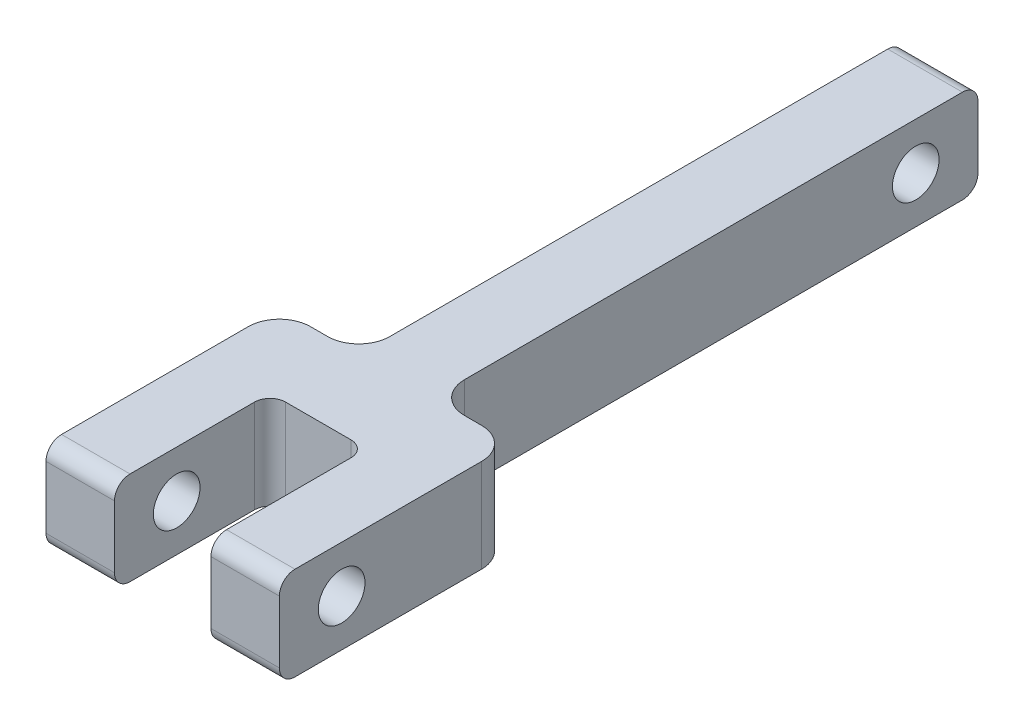
ISO-10303-21;
HEADER;
FILE_DESCRIPTION(('STEP AP214'),'2;1');
FILE_NAME('part.step','',(''),(''),'','','');
FILE_SCHEMA(('AUTOMOTIVE_DESIGN { 1 0 10303 214 1 1 1 1 }'));
ENDSEC;
DATA;
#1=APPLICATION_CONTEXT('core data for automotive mechanical design processes');
#2=APPLICATION_PROTOCOL_DEFINITION('international standard','automotive_design',2000,#1);
#3=PRODUCT_CONTEXT('',#1,'mechanical');
#4=PRODUCT('Part','Part','',(#3));
#5=PRODUCT_RELATED_PRODUCT_CATEGORY('part','',(#4));
#6=PRODUCT_DEFINITION_FORMATION('','',#4);
#7=PRODUCT_DEFINITION_CONTEXT('part definition',#1,'design');
#8=PRODUCT_DEFINITION('design','',#6,#7);
#9=PRODUCT_DEFINITION_SHAPE('','',#8);
#10=(LENGTH_UNIT() NAMED_UNIT(*) SI_UNIT(.MILLI.,.METRE.));
#11=(NAMED_UNIT(*) PLANE_ANGLE_UNIT() SI_UNIT($,.RADIAN.));
#12=(NAMED_UNIT(*) SI_UNIT($,.STERADIAN.) SOLID_ANGLE_UNIT());
#13=UNCERTAINTY_MEASURE_WITH_UNIT(LENGTH_MEASURE(1.E-05),#10,'distance_accuracy_value','');
#14=(GEOMETRIC_REPRESENTATION_CONTEXT(3) GLOBAL_UNCERTAINTY_ASSIGNED_CONTEXT((#13)) GLOBAL_UNIT_ASSIGNED_CONTEXT((#10,
#11,#12)) REPRESENTATION_CONTEXT('',''));
#15=CARTESIAN_POINT('',(0.,0.,0.));
#16=DIRECTION('',(0.,0.,1.));
#17=DIRECTION('',(1.,0.,0.));
#18=AXIS2_PLACEMENT_3D('',#15,#16,#17);
#19=CARTESIAN_POINT('',(2.4,-2.,24.));
#20=DIRECTION('',(-1.,0.,0.));
#21=DIRECTION('',(0.,0.,1.));
#22=AXIS2_PLACEMENT_3D('',#19,#20,#21);
#23=CYLINDRICAL_SURFACE('',#22,1.);
#24=CARTESIAN_POINT('',(-3.1,-2.,24.));
#25=DIRECTION('',(1.,0.,0.));
#26=DIRECTION('',(0.,0.,-1.));
#27=AXIS2_PLACEMENT_3D('',#24,#25,#26);
#28=CIRCLE('',#27,1.);
#29=CARTESIAN_POINT('',(-3.1,-2.,25.));
#30=VERTEX_POINT('',#29);
#31=CARTESIAN_POINT('',(-3.1,-3.,24.));
#32=VERTEX_POINT('',#31);
#33=EDGE_CURVE('E216',#30,#32,#28,.T.);
#34=ORIENTED_EDGE('',*,*,#33,.F.);
#35=DIRECTION('',(-1.,0.,0.));
#36=VECTOR('',#35,1.);
#37=CARTESIAN_POINT('',(2.4,-2.,25.));
#38=LINE('',#37,#36);
#39=CARTESIAN_POINT('',(-7.5,-2.,25.));
#40=VERTEX_POINT('',#39);
#41=EDGE_CURVE('E215',#30,#40,#38,.T.);
#42=ORIENTED_EDGE('',*,*,#41,.T.);
#43=CARTESIAN_POINT('',(-7.5,-2.,24.));
#44=DIRECTION('',(1.,0.,0.));
#45=DIRECTION('',(0.,0.,-1.));
#46=AXIS2_PLACEMENT_3D('',#43,#44,#45);
#47=CIRCLE('',#46,1.);
#48=CARTESIAN_POINT('',(-7.5,-3.,24.));
#49=VERTEX_POINT('',#48);
#50=EDGE_CURVE('E361',#40,#49,#47,.T.);
#51=ORIENTED_EDGE('',*,*,#50,.T.);
#52=DIRECTION('',(-1.,0.,0.));
#53=VECTOR('',#52,1.);
#54=CARTESIAN_POINT('',(2.4,-3.,24.));
#55=LINE('',#54,#53);
#56=EDGE_CURVE('E246',#32,#49,#55,.T.);
#57=ORIENTED_EDGE('',*,*,#56,.F.);
#58=EDGE_LOOP('',(#34,#42,#51,#57));
#59=FACE_BOUND('',#58,.T.);
#60=ADVANCED_FACE('F35',(#59),#23,.T.);
#61=CARTESIAN_POINT('',(2.4,-3.,24.));
#62=DIRECTION('',(0.,1.,0.));
#63=DIRECTION('',(0.,0.,1.));
#64=AXIS2_PLACEMENT_3D('',#61,#62,#63);
#65=PLANE('',#64);
#66=DIRECTION('',(-1.,0.,0.));
#67=VECTOR('',#66,1.);
#68=CARTESIAN_POINT('',(7.5,-3.,10.));
#69=LINE('',#68,#67);
#70=CARTESIAN_POINT('',(5.5,-3.,10.));
#71=VERTEX_POINT('',#70);
#72=CARTESIAN_POINT('',(4.4,-3.,10.));
#73=VERTEX_POINT('',#72);
#74=EDGE_CURVE('E374',#71,#73,#69,.T.);
#75=ORIENTED_EDGE('',*,*,#74,.F.);
#76=CARTESIAN_POINT('',(5.5,-3.,12.));
#77=DIRECTION('',(0.,1.,0.));
#78=DIRECTION('',(0.,0.,1.));
#79=AXIS2_PLACEMENT_3D('',#76,#77,#78);
#80=CIRCLE('',#79,2.);
#81=CARTESIAN_POINT('',(7.5,-3.,12.));
#82=VERTEX_POINT('',#81);
#83=EDGE_CURVE('E271',#71,#82,#80,.F.);
#84=ORIENTED_EDGE('',*,*,#83,.T.);
#85=DIRECTION('',(0.,0.,-1.));
#86=VECTOR('',#85,1.);
#87=CARTESIAN_POINT('',(7.5,-3.,10.));
#88=LINE('',#87,#86);
#89=CARTESIAN_POINT('',(7.5,-3.,24.));
#90=VERTEX_POINT('',#89);
#91=EDGE_CURVE('E352',#90,#82,#88,.T.);
#92=ORIENTED_EDGE('',*,*,#91,.F.);
#93=CARTESIAN_POINT('',(3.1,-3.,24.));
#94=VERTEX_POINT('',#93);
#95=EDGE_CURVE('E247',#90,#94,#55,.T.);
#96=ORIENTED_EDGE('',*,*,#95,.T.);
#97=DIRECTION('',(0.,0.,-1.));
#98=VECTOR('',#97,1.);
#99=CARTESIAN_POINT('',(3.1,-3.,15.));
#100=LINE('',#99,#98);
#101=CARTESIAN_POINT('',(3.1,-3.,16.));
#102=VERTEX_POINT('',#101);
#103=EDGE_CURVE('E332',#94,#102,#100,.T.);
#104=ORIENTED_EDGE('',*,*,#103,.T.);
#105=CARTESIAN_POINT('',(2.1,-3.,16.));
#106=DIRECTION('',(0.,1.,0.));
#107=DIRECTION('',(0.,0.,1.));
#108=AXIS2_PLACEMENT_3D('',#105,#106,#107);
#109=CIRCLE('',#108,1.);
#110=CARTESIAN_POINT('',(2.1,-3.,15.));
#111=VERTEX_POINT('',#110);
#112=EDGE_CURVE('E305',#102,#111,#109,.T.);
#113=ORIENTED_EDGE('',*,*,#112,.T.);
#114=DIRECTION('',(1.,0.,0.));
#115=VECTOR('',#114,1.);
#116=CARTESIAN_POINT('',(-3.1,-3.,15.));
#117=LINE('',#116,#115);
#118=CARTESIAN_POINT('',(-2.1,-3.,15.));
#119=VERTEX_POINT('',#118);
#120=EDGE_CURVE('E315',#119,#111,#117,.T.);
#121=ORIENTED_EDGE('',*,*,#120,.F.);
#122=CARTESIAN_POINT('',(-2.1,-3.,16.));
#123=DIRECTION('',(0.,1.,0.));
#124=DIRECTION('',(0.,0.,1.));
#125=AXIS2_PLACEMENT_3D('',#122,#123,#124);
#126=CIRCLE('',#125,1.);
#127=CARTESIAN_POINT('',(-3.1,-3.,16.));
#128=VERTEX_POINT('',#127);
#129=EDGE_CURVE('E11',#119,#128,#126,.T.);
#130=ORIENTED_EDGE('',*,*,#129,.T.);
#131=DIRECTION('',(0.,0.,-1.));
#132=VECTOR('',#131,1.);
#133=CARTESIAN_POINT('',(-3.1,-3.,15.));
#134=LINE('',#133,#132);
#135=EDGE_CURVE('E317',#32,#128,#134,.T.);
#136=ORIENTED_EDGE('',*,*,#135,.F.);
#137=ORIENTED_EDGE('',*,*,#56,.T.);
#138=DIRECTION('',(0.,0.,-1.));
#139=VECTOR('',#138,1.);
#140=CARTESIAN_POINT('',(-7.5,-3.,10.));
#141=LINE('',#140,#139);
#142=CARTESIAN_POINT('',(-7.5,-3.,12.));
#143=VERTEX_POINT('',#142);
#144=EDGE_CURVE('E364',#49,#143,#141,.T.);
#145=ORIENTED_EDGE('',*,*,#144,.T.);
#146=CARTESIAN_POINT('',(-5.5,-3.,12.));
#147=DIRECTION('',(0.,1.,0.));
#148=DIRECTION('',(0.,0.,1.));
#149=AXIS2_PLACEMENT_3D('',#146,#147,#148);
#150=CIRCLE('',#149,2.);
#151=CARTESIAN_POINT('',(-5.5,-3.,10.));
#152=VERTEX_POINT('',#151);
#153=EDGE_CURVE('E269',#143,#152,#150,.F.);
#154=ORIENTED_EDGE('',*,*,#153,.T.);
#155=CARTESIAN_POINT('',(-4.4,-3.,10.));
#156=VERTEX_POINT('',#155);
#157=EDGE_CURVE('E371',#156,#152,#69,.T.);
#158=ORIENTED_EDGE('',*,*,#157,.F.);
#159=CARTESIAN_POINT('',(-4.4,-3.,8.));
#160=DIRECTION('',(0.,1.,0.));
#161=DIRECTION('',(0.,0.,1.));
#162=AXIS2_PLACEMENT_3D('',#159,#160,#161);
#163=CIRCLE('',#162,2.);
#164=CARTESIAN_POINT('',(-2.4,-3.,8.));
#165=VERTEX_POINT('',#164);
#166=EDGE_CURVE('E290',#156,#165,#163,.T.);
#167=ORIENTED_EDGE('',*,*,#166,.T.);
#168=DIRECTION('',(0.,0.,-1.));
#169=VECTOR('',#168,1.);
#170=CARTESIAN_POINT('',(-2.4,-3.,24.));
#171=LINE('',#170,#169);
#172=CARTESIAN_POINT('',(-2.4,-3.,-24.));
#173=VERTEX_POINT('',#172);
#174=EDGE_CURVE('E381',#165,#173,#171,.T.);
#175=ORIENTED_EDGE('',*,*,#174,.T.);
#176=DIRECTION('',(-1.,0.,0.));
#177=VECTOR('',#176,1.);
#178=CARTESIAN_POINT('',(2.4,-3.,-24.));
#179=LINE('',#178,#177);
#180=CARTESIAN_POINT('',(2.4,-3.,-24.));
#181=VERTEX_POINT('',#180);
#182=EDGE_CURVE('E243',#181,#173,#179,.T.);
#183=ORIENTED_EDGE('',*,*,#182,.F.);
#184=DIRECTION('',(0.,0.,-1.));
#185=VECTOR('',#184,1.);
#186=CARTESIAN_POINT('',(2.4,-3.,24.));
#187=LINE('',#186,#185);
#188=CARTESIAN_POINT('',(2.4,-3.,8.));
#189=VERTEX_POINT('',#188);
#190=EDGE_CURVE('E382',#189,#181,#187,.T.);
#191=ORIENTED_EDGE('',*,*,#190,.F.);
#192=CARTESIAN_POINT('',(4.4,-3.,8.));
#193=DIRECTION('',(0.,1.,0.));
#194=DIRECTION('',(0.,0.,1.));
#195=AXIS2_PLACEMENT_3D('',#192,#193,#194);
#196=CIRCLE('',#195,2.);
#197=EDGE_CURVE('E286',#189,#73,#196,.T.);
#198=ORIENTED_EDGE('',*,*,#197,.T.);
#199=EDGE_LOOP('',(#75,#84,#92,#96,#104,#113,#121,#130,#136,#137,#145,#154,#158,#167,#175,#183,
#191,#198));
#200=FACE_BOUND('',#199,.T.);
#201=ADVANCED_FACE('F417',(#200),#65,.F.);
#202=CARTESIAN_POINT('',(2.4,3.,24.));
#203=DIRECTION('',(0.,-1.,0.));
#204=DIRECTION('',(0.,0.,-1.));
#205=AXIS2_PLACEMENT_3D('',#202,#203,#204);
#206=PLANE('',#205);
#207=DIRECTION('',(0.,0.,1.));
#208=VECTOR('',#207,1.);
#209=CARTESIAN_POINT('',(7.5,3.,24.));
#210=LINE('',#209,#208);
#211=CARTESIAN_POINT('',(7.5,3.,12.));
#212=VERTEX_POINT('',#211);
#213=CARTESIAN_POINT('',(7.5,3.,24.));
#214=VERTEX_POINT('',#213);
#215=EDGE_CURVE('E355',#212,#214,#210,.T.);
#216=ORIENTED_EDGE('',*,*,#215,.F.);
#217=CARTESIAN_POINT('',(5.5,3.,12.));
#218=DIRECTION('',(0.,-1.,0.));
#219=DIRECTION('',(0.,0.,-1.));
#220=AXIS2_PLACEMENT_3D('',#217,#218,#219);
#221=CIRCLE('',#220,2.);
#222=CARTESIAN_POINT('',(5.5,3.,10.));
#223=VERTEX_POINT('',#222);
#224=EDGE_CURVE('E263',#212,#223,#221,.F.);
#225=ORIENTED_EDGE('',*,*,#224,.T.);
#226=DIRECTION('',(-1.,0.,0.));
#227=VECTOR('',#226,1.);
#228=CARTESIAN_POINT('',(7.5,3.,10.));
#229=LINE('',#228,#227);
#230=CARTESIAN_POINT('',(4.4,3.,10.));
#231=VERTEX_POINT('',#230);
#232=EDGE_CURVE('E370',#223,#231,#229,.T.);
#233=ORIENTED_EDGE('',*,*,#232,.T.);
#234=CARTESIAN_POINT('',(4.4,3.,8.));
#235=DIRECTION('',(0.,-1.,0.));
#236=DIRECTION('',(0.,0.,-1.));
#237=AXIS2_PLACEMENT_3D('',#234,#235,#236);
#238=CIRCLE('',#237,2.);
#239=CARTESIAN_POINT('',(2.4,3.,8.));
#240=VERTEX_POINT('',#239);
#241=EDGE_CURVE('E288',#231,#240,#238,.T.);
#242=ORIENTED_EDGE('',*,*,#241,.T.);
#243=DIRECTION('',(0.,0.,1.));
#244=VECTOR('',#243,1.);
#245=CARTESIAN_POINT('',(2.4,3.,24.));
#246=LINE('',#245,#244);
#247=CARTESIAN_POINT('',(2.4,3.,-24.));
#248=VERTEX_POINT('',#247);
#249=EDGE_CURVE('E391',#248,#240,#246,.T.);
#250=ORIENTED_EDGE('',*,*,#249,.F.);
#251=DIRECTION('',(-1.,0.,0.));
#252=VECTOR('',#251,1.);
#253=CARTESIAN_POINT('',(2.4,3.,-24.));
#254=LINE('',#253,#252);
#255=CARTESIAN_POINT('',(-2.4,3.,-24.));
#256=VERTEX_POINT('',#255);
#257=EDGE_CURVE('E234',#248,#256,#254,.T.);
#258=ORIENTED_EDGE('',*,*,#257,.T.);
#259=DIRECTION('',(0.,0.,1.));
#260=VECTOR('',#259,1.);
#261=CARTESIAN_POINT('',(-2.4,3.,24.));
#262=LINE('',#261,#260);
#263=CARTESIAN_POINT('',(-2.4,3.,8.));
#264=VERTEX_POINT('',#263);
#265=EDGE_CURVE('E385',#256,#264,#262,.T.);
#266=ORIENTED_EDGE('',*,*,#265,.T.);
#267=CARTESIAN_POINT('',(-4.4,3.,8.));
#268=DIRECTION('',(0.,-1.,0.));
#269=DIRECTION('',(0.,0.,-1.));
#270=AXIS2_PLACEMENT_3D('',#267,#268,#269);
#271=CIRCLE('',#270,2.);
#272=CARTESIAN_POINT('',(-4.4,3.,10.));
#273=VERTEX_POINT('',#272);
#274=EDGE_CURVE('E292',#264,#273,#271,.T.);
#275=ORIENTED_EDGE('',*,*,#274,.T.);
#276=CARTESIAN_POINT('',(-5.5,3.,10.));
#277=VERTEX_POINT('',#276);
#278=EDGE_CURVE('E357',#273,#277,#229,.T.);
#279=ORIENTED_EDGE('',*,*,#278,.T.);
#280=CARTESIAN_POINT('',(-5.5,3.,12.));
#281=DIRECTION('',(0.,-1.,0.));
#282=DIRECTION('',(0.,0.,-1.));
#283=AXIS2_PLACEMENT_3D('',#280,#281,#282);
#284=CIRCLE('',#283,2.);
#285=CARTESIAN_POINT('',(-7.5,3.,12.));
#286=VERTEX_POINT('',#285);
#287=EDGE_CURVE('E261',#277,#286,#284,.F.);
#288=ORIENTED_EDGE('',*,*,#287,.T.);
#289=DIRECTION('',(0.,0.,1.));
#290=VECTOR('',#289,1.);
#291=CARTESIAN_POINT('',(-7.5,3.,24.));
#292=LINE('',#291,#290);
#293=CARTESIAN_POINT('',(-7.5,3.,24.));
#294=VERTEX_POINT('',#293);
#295=EDGE_CURVE('E346',#286,#294,#292,.T.);
#296=ORIENTED_EDGE('',*,*,#295,.T.);
#297=DIRECTION('',(-1.,0.,0.));
#298=VECTOR('',#297,1.);
#299=CARTESIAN_POINT('',(2.4,3.,24.));
#300=LINE('',#299,#298);
#301=CARTESIAN_POINT('',(-3.1,3.,24.));
#302=VERTEX_POINT('',#301);
#303=EDGE_CURVE('E226',#302,#294,#300,.T.);
#304=ORIENTED_EDGE('',*,*,#303,.F.);
#305=DIRECTION('',(0.,0.,1.));
#306=VECTOR('',#305,1.);
#307=CARTESIAN_POINT('',(-3.1,3.,24.));
#308=LINE('',#307,#306);
#309=CARTESIAN_POINT('',(-3.1,3.,16.));
#310=VERTEX_POINT('',#309);
#311=EDGE_CURVE('E202',#310,#302,#308,.T.);
#312=ORIENTED_EDGE('',*,*,#311,.F.);
#313=CARTESIAN_POINT('',(-2.1,3.,16.));
#314=DIRECTION('',(0.,-1.,0.));
#315=DIRECTION('',(0.,0.,-1.));
#316=AXIS2_PLACEMENT_3D('',#313,#314,#315);
#317=CIRCLE('',#316,1.);
#318=CARTESIAN_POINT('',(-2.1,3.,15.));
#319=VERTEX_POINT('',#318);
#320=EDGE_CURVE('E43',#310,#319,#317,.T.);
#321=ORIENTED_EDGE('',*,*,#320,.T.);
#322=DIRECTION('',(1.,0.,0.));
#323=VECTOR('',#322,1.);
#324=CARTESIAN_POINT('',(-3.1,3.,15.));
#325=LINE('',#324,#323);
#326=CARTESIAN_POINT('',(2.1,3.,15.));
#327=VERTEX_POINT('',#326);
#328=EDGE_CURVE('E255',#319,#327,#325,.T.);
#329=ORIENTED_EDGE('',*,*,#328,.T.);
#330=CARTESIAN_POINT('',(2.1,3.,16.));
#331=DIRECTION('',(0.,-1.,0.));
#332=DIRECTION('',(0.,0.,-1.));
#333=AXIS2_PLACEMENT_3D('',#330,#331,#332);
#334=CIRCLE('',#333,1.);
#335=CARTESIAN_POINT('',(3.1,3.,16.));
#336=VERTEX_POINT('',#335);
#337=EDGE_CURVE('E303',#327,#336,#334,.T.);
#338=ORIENTED_EDGE('',*,*,#337,.T.);
#339=DIRECTION('',(0.,0.,1.));
#340=VECTOR('',#339,1.);
#341=CARTESIAN_POINT('',(3.1,3.,24.));
#342=LINE('',#341,#340);
#343=CARTESIAN_POINT('',(3.1,3.,24.));
#344=VERTEX_POINT('',#343);
#345=EDGE_CURVE('E207',#336,#344,#342,.T.);
#346=ORIENTED_EDGE('',*,*,#345,.T.);
#347=EDGE_CURVE('E231',#214,#344,#300,.T.);
#348=ORIENTED_EDGE('',*,*,#347,.F.);
#349=EDGE_LOOP('',(#216,#225,#233,#242,#250,#258,#266,#275,#279,#288,#296,#304,#312,#321,#329,
#338,#346,#348));
#350=FACE_BOUND('',#349,.T.);
#351=ADVANCED_FACE('F310',(#350),#206,.F.);
#352=CARTESIAN_POINT('',(2.4,2.,24.));
#353=DIRECTION('',(-1.,0.,0.));
#354=DIRECTION('',(0.,0.,1.));
#355=AXIS2_PLACEMENT_3D('',#352,#353,#354);
#356=CYLINDRICAL_SURFACE('',#355,1.);
#357=CARTESIAN_POINT('',(-3.1,2.,24.));
#358=DIRECTION('',(1.,0.,0.));
#359=DIRECTION('',(0.,0.,-1.));
#360=AXIS2_PLACEMENT_3D('',#357,#358,#359);
#361=CIRCLE('',#360,1.);
#362=CARTESIAN_POINT('',(-3.1,2.,25.));
#363=VERTEX_POINT('',#362);
#364=EDGE_CURVE('E195',#302,#363,#361,.T.);
#365=ORIENTED_EDGE('',*,*,#364,.F.);
#366=ORIENTED_EDGE('',*,*,#303,.T.);
#367=CARTESIAN_POINT('',(-7.5,2.,24.));
#368=DIRECTION('',(1.,0.,0.));
#369=DIRECTION('',(0.,0.,-1.));
#370=AXIS2_PLACEMENT_3D('',#367,#368,#369);
#371=CIRCLE('',#370,1.);
#372=CARTESIAN_POINT('',(-7.5,2.,25.));
#373=VERTEX_POINT('',#372);
#374=EDGE_CURVE('E221',#294,#373,#371,.T.);
#375=ORIENTED_EDGE('',*,*,#374,.T.);
#376=DIRECTION('',(-1.,0.,0.));
#377=VECTOR('',#376,1.);
#378=CARTESIAN_POINT('',(2.4,2.,25.));
#379=LINE('',#378,#377);
#380=EDGE_CURVE('E213',#363,#373,#379,.T.);
#381=ORIENTED_EDGE('',*,*,#380,.F.);
#382=EDGE_LOOP('',(#365,#366,#375,#381));
#383=FACE_BOUND('',#382,.T.);
#384=ADVANCED_FACE('F219',(#383),#356,.T.);
#385=CARTESIAN_POINT('',(2.4,2.,25.));
#386=DIRECTION('',(0.,0.,-1.));
#387=DIRECTION('',(-1.,0.,0.));
#388=AXIS2_PLACEMENT_3D('',#385,#386,#387);
#389=PLANE('',#388);
#390=DIRECTION('',(0.,-1.,0.));
#391=VECTOR('',#390,1.);
#392=CARTESIAN_POINT('',(-3.1,2.,25.));
#393=LINE('',#392,#391);
#394=EDGE_CURVE('E199',#363,#30,#393,.T.);
#395=ORIENTED_EDGE('',*,*,#394,.F.);
#396=ORIENTED_EDGE('',*,*,#380,.T.);
#397=DIRECTION('',(0.,-1.,0.));
#398=VECTOR('',#397,1.);
#399=CARTESIAN_POINT('',(-7.5,2.,25.));
#400=LINE('',#399,#398);
#401=EDGE_CURVE('E359',#373,#40,#400,.T.);
#402=ORIENTED_EDGE('',*,*,#401,.T.);
#403=ORIENTED_EDGE('',*,*,#41,.F.);
#404=EDGE_LOOP('',(#395,#396,#402,#403));
#405=FACE_BOUND('',#404,.T.);
#406=ADVANCED_FACE('F211',(#405),#389,.F.);
#407=CARTESIAN_POINT('',(-2.4,0.,21.));
#408=DIRECTION('',(1.,0.,0.));
#409=DIRECTION('',(0.,0.,-1.));
#410=AXIS2_PLACEMENT_3D('',#407,#408,#409);
#411=CYLINDRICAL_SURFACE('',#410,1.5);
#412=CARTESIAN_POINT('',(-7.5,0.,21.));
#413=DIRECTION('',(1.,0.,0.));
#414=DIRECTION('',(0.,0.,-1.));
#415=AXIS2_PLACEMENT_3D('',#412,#413,#414);
#416=CIRCLE('',#415,1.5);
#417=CARTESIAN_POINT('',(-7.5,0.,19.5));
#418=VERTEX_POINT('',#417);
#419=EDGE_CURVE('E258',#418,#418,#416,.T.);
#420=ORIENTED_EDGE('',*,*,#419,.F.);
#421=EDGE_LOOP('',(#420));
#422=FACE_BOUND('',#421,.T.);
#423=CARTESIAN_POINT('',(-3.1,0.,21.));
#424=DIRECTION('',(1.,0.,0.));
#425=DIRECTION('',(0.,0.,-1.));
#426=AXIS2_PLACEMENT_3D('',#423,#424,#425);
#427=CIRCLE('',#426,1.5);
#428=CARTESIAN_POINT('',(-3.1,0.,19.5));
#429=VERTEX_POINT('',#428);
#430=EDGE_CURVE('E254',#429,#429,#427,.F.);
#431=ORIENTED_EDGE('',*,*,#430,.F.);
#432=EDGE_LOOP('',(#431));
#433=FACE_BOUND('',#432,.T.);
#434=ADVANCED_FACE('F517',(#422,#433),#411,.F.);
#435=CARTESIAN_POINT('',(2.4,-2.,24.));
#436=DIRECTION('',(1.,0.,0.));
#437=DIRECTION('',(0.,0.,-1.));
#438=AXIS2_PLACEMENT_3D('',#435,#436,#437);
#439=PLANE('',#438);
#440=CARTESIAN_POINT('',(2.4,0.,-21.));
#441=DIRECTION('',(1.,0.,0.));
#442=DIRECTION('',(0.,0.,-1.));
#443=AXIS2_PLACEMENT_3D('',#440,#441,#442);
#444=CIRCLE('',#443,1.50000000000001);
#445=CARTESIAN_POINT('',(2.4,0.,-22.5));
#446=VERTEX_POINT('',#445);
#447=EDGE_CURVE('E375',#446,#446,#444,.T.);
#448=ORIENTED_EDGE('',*,*,#447,.F.);
#449=EDGE_LOOP('',(#448));
#450=FACE_BOUND('',#449,.T.);
#451=ORIENTED_EDGE('',*,*,#249,.T.);
#452=DIRECTION('',(0.,-1.,0.));
#453=VECTOR('',#452,1.);
#454=CARTESIAN_POINT('',(2.4,-2.,8.));
#455=LINE('',#454,#453);
#456=EDGE_CURVE('E281',#240,#189,#455,.T.);
#457=ORIENTED_EDGE('',*,*,#456,.T.);
#458=ORIENTED_EDGE('',*,*,#190,.T.);
#459=CARTESIAN_POINT('',(2.4,-2.,-24.));
#460=DIRECTION('',(1.,0.,0.));
#461=DIRECTION('',(0.,0.,-1.));
#462=AXIS2_PLACEMENT_3D('',#459,#460,#461);
#463=CIRCLE('',#462,1.);
#464=CARTESIAN_POINT('',(2.4,-2.,-25.));
#465=VERTEX_POINT('',#464);
#466=EDGE_CURVE('E384',#181,#465,#463,.T.);
#467=ORIENTED_EDGE('',*,*,#466,.T.);
#468=DIRECTION('',(0.,1.,0.));
#469=VECTOR('',#468,1.);
#470=CARTESIAN_POINT('',(2.4,2.,-25.));
#471=LINE('',#470,#469);
#472=CARTESIAN_POINT('',(2.4,2.,-25.));
#473=VERTEX_POINT('',#472);
#474=EDGE_CURVE('E387',#465,#473,#471,.T.);
#475=ORIENTED_EDGE('',*,*,#474,.T.);
#476=CARTESIAN_POINT('',(2.4,2.,-24.));
#477=DIRECTION('',(1.,0.,0.));
#478=DIRECTION('',(0.,0.,1.));
#479=AXIS2_PLACEMENT_3D('',#476,#477,#478);
#480=CIRCLE('',#479,1.);
#481=EDGE_CURVE('E389',#473,#248,#480,.T.);
#482=ORIENTED_EDGE('',*,*,#481,.T.);
#483=EDGE_LOOP('',(#451,#457,#458,#467,#475,#482));
#484=FACE_BOUND('',#483,.T.);
#485=ADVANCED_FACE('F449',(#450,#484),#439,.T.);
#486=CARTESIAN_POINT('',(-2.4,-2.,24.));
#487=DIRECTION('',(1.,0.,0.));
#488=DIRECTION('',(0.,0.,-1.));
#489=AXIS2_PLACEMENT_3D('',#486,#487,#488);
#490=PLANE('',#489);
#491=CARTESIAN_POINT('',(-2.4,0.,-21.));
#492=DIRECTION('',(1.,0.,0.));
#493=DIRECTION('',(0.,0.,-1.));
#494=AXIS2_PLACEMENT_3D('',#491,#492,#493);
#495=CIRCLE('',#494,1.50000000000001);
#496=CARTESIAN_POINT('',(-2.4,0.,-22.5));
#497=VERTEX_POINT('',#496);
#498=EDGE_CURVE('E378',#497,#497,#495,.T.);
#499=ORIENTED_EDGE('',*,*,#498,.T.);
#500=EDGE_LOOP('',(#499));
#501=FACE_BOUND('',#500,.T.);
#502=ORIENTED_EDGE('',*,*,#174,.F.);
#503=DIRECTION('',(0.,-1.,0.));
#504=VECTOR('',#503,1.);
#505=CARTESIAN_POINT('',(-2.4,3.,8.));
#506=LINE('',#505,#504);
#507=EDGE_CURVE('E284',#165,#264,#506,.F.);
#508=ORIENTED_EDGE('',*,*,#507,.T.);
#509=ORIENTED_EDGE('',*,*,#265,.F.);
#510=CARTESIAN_POINT('',(-2.4,2.,-24.));
#511=DIRECTION('',(1.,0.,0.));
#512=DIRECTION('',(0.,0.,1.));
#513=AXIS2_PLACEMENT_3D('',#510,#511,#512);
#514=CIRCLE('',#513,1.);
#515=CARTESIAN_POINT('',(-2.4,2.,-25.));
#516=VERTEX_POINT('',#515);
#517=EDGE_CURVE('E399',#516,#256,#514,.T.);
#518=ORIENTED_EDGE('',*,*,#517,.F.);
#519=DIRECTION('',(0.,1.,0.));
#520=VECTOR('',#519,1.);
#521=CARTESIAN_POINT('',(-2.4,2.,-25.));
#522=LINE('',#521,#520);
#523=CARTESIAN_POINT('',(-2.4,-2.,-25.));
#524=VERTEX_POINT('',#523);
#525=EDGE_CURVE('E397',#524,#516,#522,.T.);
#526=ORIENTED_EDGE('',*,*,#525,.F.);
#527=CARTESIAN_POINT('',(-2.4,-2.,-24.));
#528=DIRECTION('',(1.,0.,0.));
#529=DIRECTION('',(0.,0.,-1.));
#530=AXIS2_PLACEMENT_3D('',#527,#528,#529);
#531=CIRCLE('',#530,1.);
#532=EDGE_CURVE('E395',#173,#524,#531,.T.);
#533=ORIENTED_EDGE('',*,*,#532,.F.);
#534=EDGE_LOOP('',(#502,#508,#509,#518,#526,#533));
#535=FACE_BOUND('',#534,.T.);
#536=ADVANCED_FACE('F440',(#501,#535),#490,.F.);
#537=CARTESIAN_POINT('',(7.5,-2.,25.));
#538=VERTEX_POINT('',#537);
#539=CARTESIAN_POINT('',(3.1,-2.,25.));
#540=VERTEX_POINT('',#539);
#541=EDGE_CURVE('E223',#538,#540,#38,.T.);
#542=ORIENTED_EDGE('',*,*,#541,.T.);
#543=CARTESIAN_POINT('',(3.1,-2.,24.));
#544=DIRECTION('',(1.,0.,0.));
#545=DIRECTION('',(0.,0.,-1.));
#546=AXIS2_PLACEMENT_3D('',#543,#544,#545);
#547=CIRCLE('',#546,1.);
#548=EDGE_CURVE('E329',#540,#94,#547,.T.);
#549=ORIENTED_EDGE('',*,*,#548,.T.);
#550=ORIENTED_EDGE('',*,*,#95,.F.);
#551=CARTESIAN_POINT('',(7.5,-2.,24.));
#552=DIRECTION('',(1.,0.,0.));
#553=DIRECTION('',(0.,0.,-1.));
#554=AXIS2_PLACEMENT_3D('',#551,#552,#553);
#555=CIRCLE('',#554,1.);
#556=EDGE_CURVE('E349',#538,#90,#555,.T.);
#557=ORIENTED_EDGE('',*,*,#556,.F.);
#558=EDGE_LOOP('',(#542,#549,#550,#557));
#559=FACE_BOUND('',#558,.T.);
#560=ADVANCED_FACE('F432',(#559),#23,.T.);
#561=CARTESIAN_POINT('',(2.4,-2.,-24.));
#562=DIRECTION('',(-1.,0.,0.));
#563=DIRECTION('',(0.,0.,1.));
#564=AXIS2_PLACEMENT_3D('',#561,#562,#563);
#565=CYLINDRICAL_SURFACE('',#564,1.);
#566=ORIENTED_EDGE('',*,*,#532,.T.);
#567=DIRECTION('',(-1.,0.,0.));
#568=VECTOR('',#567,1.);
#569=CARTESIAN_POINT('',(2.4,-2.,-25.));
#570=LINE('',#569,#568);
#571=EDGE_CURVE('E240',#465,#524,#570,.T.);
#572=ORIENTED_EDGE('',*,*,#571,.F.);
#573=ORIENTED_EDGE('',*,*,#466,.F.);
#574=ORIENTED_EDGE('',*,*,#182,.T.);
#575=EDGE_LOOP('',(#566,#572,#573,#574));
#576=FACE_BOUND('',#575,.T.);
#577=ADVANCED_FACE('F439',(#576),#565,.T.);
#578=CARTESIAN_POINT('',(2.4,2.,-25.));
#579=DIRECTION('',(0.,0.,1.));
#580=DIRECTION('',(1.,0.,0.));
#581=AXIS2_PLACEMENT_3D('',#578,#579,#580);
#582=PLANE('',#581);
#583=ORIENTED_EDGE('',*,*,#525,.T.);
#584=DIRECTION('',(-1.,0.,0.));
#585=VECTOR('',#584,1.);
#586=CARTESIAN_POINT('',(2.4,2.,-25.));
#587=LINE('',#586,#585);
#588=EDGE_CURVE('E237',#473,#516,#587,.T.);
#589=ORIENTED_EDGE('',*,*,#588,.F.);
#590=ORIENTED_EDGE('',*,*,#474,.F.);
#591=ORIENTED_EDGE('',*,*,#571,.T.);
#592=EDGE_LOOP('',(#583,#589,#590,#591));
#593=FACE_BOUND('',#592,.T.);
#594=ADVANCED_FACE('F446',(#593),#582,.F.);
#595=CARTESIAN_POINT('',(2.4,2.,-24.));
#596=DIRECTION('',(-1.,0.,0.));
#597=DIRECTION('',(0.,0.,1.));
#598=AXIS2_PLACEMENT_3D('',#595,#596,#597);
#599=CYLINDRICAL_SURFACE('',#598,1.);
#600=ORIENTED_EDGE('',*,*,#517,.T.);
#601=ORIENTED_EDGE('',*,*,#257,.F.);
#602=ORIENTED_EDGE('',*,*,#481,.F.);
#603=ORIENTED_EDGE('',*,*,#588,.T.);
#604=EDGE_LOOP('',(#600,#601,#602,#603));
#605=FACE_BOUND('',#604,.T.);
#606=ADVANCED_FACE('F494',(#605),#599,.T.);
#607=ORIENTED_EDGE('',*,*,#347,.T.);
#608=CARTESIAN_POINT('',(3.1,2.,24.));
#609=DIRECTION('',(1.,0.,0.));
#610=DIRECTION('',(0.,0.,-1.));
#611=AXIS2_PLACEMENT_3D('',#608,#609,#610);
#612=CIRCLE('',#611,1.);
#613=CARTESIAN_POINT('',(3.1,2.,25.));
#614=VERTEX_POINT('',#613);
#615=EDGE_CURVE('E323',#344,#614,#612,.T.);
#616=ORIENTED_EDGE('',*,*,#615,.T.);
#617=CARTESIAN_POINT('',(7.5,2.,25.));
#618=VERTEX_POINT('',#617);
#619=EDGE_CURVE('E222',#618,#614,#379,.T.);
#620=ORIENTED_EDGE('',*,*,#619,.F.);
#621=CARTESIAN_POINT('',(7.5,2.,24.));
#622=DIRECTION('',(1.,0.,0.));
#623=DIRECTION('',(0.,0.,-1.));
#624=AXIS2_PLACEMENT_3D('',#621,#622,#623);
#625=CIRCLE('',#624,1.);
#626=EDGE_CURVE('E342',#214,#618,#625,.T.);
#627=ORIENTED_EDGE('',*,*,#626,.F.);
#628=EDGE_LOOP('',(#607,#616,#620,#627));
#629=FACE_BOUND('',#628,.T.);
#630=ADVANCED_FACE('F463',(#629),#356,.T.);
#631=ORIENTED_EDGE('',*,*,#619,.T.);
#632=DIRECTION('',(0.,-1.,0.));
#633=VECTOR('',#632,1.);
#634=CARTESIAN_POINT('',(3.1,2.,25.));
#635=LINE('',#634,#633);
#636=EDGE_CURVE('E326',#614,#540,#635,.T.);
#637=ORIENTED_EDGE('',*,*,#636,.T.);
#638=ORIENTED_EDGE('',*,*,#541,.F.);
#639=DIRECTION('',(0.,-1.,0.));
#640=VECTOR('',#639,1.);
#641=CARTESIAN_POINT('',(7.5,2.,25.));
#642=LINE('',#641,#640);
#643=EDGE_CURVE('E345',#618,#538,#642,.T.);
#644=ORIENTED_EDGE('',*,*,#643,.F.);
#645=EDGE_LOOP('',(#631,#637,#638,#644));
#646=FACE_BOUND('',#645,.T.);
#647=ADVANCED_FACE('F455',(#646),#389,.F.);
#648=CARTESIAN_POINT('',(-2.4,0.,-21.));
#649=DIRECTION('',(1.,0.,0.));
#650=DIRECTION('',(0.,0.,-1.));
#651=AXIS2_PLACEMENT_3D('',#648,#649,#650);
#652=CYLINDRICAL_SURFACE('',#651,1.50000000000001);
#653=ORIENTED_EDGE('',*,*,#498,.F.);
#654=EDGE_LOOP('',(#653));
#655=FACE_BOUND('',#654,.T.);
#656=ORIENTED_EDGE('',*,*,#447,.T.);
#657=EDGE_LOOP('',(#656));
#658=FACE_BOUND('',#657,.T.);
#659=ADVANCED_FACE('F513',(#655,#658),#652,.F.);
#660=CARTESIAN_POINT('',(7.5,3.,10.));
#661=DIRECTION('',(0.,0.,1.));
#662=DIRECTION('',(1.,0.,0.));
#663=AXIS2_PLACEMENT_3D('',#660,#661,#662);
#664=PLANE('',#663);
#665=ORIENTED_EDGE('',*,*,#157,.T.);
#666=DIRECTION('',(0.,1.,0.));
#667=VECTOR('',#666,1.);
#668=CARTESIAN_POINT('',(-5.5,3.,10.));
#669=LINE('',#668,#667);
#670=EDGE_CURVE('E276',#152,#277,#669,.T.);
#671=ORIENTED_EDGE('',*,*,#670,.T.);
#672=ORIENTED_EDGE('',*,*,#278,.F.);
#673=DIRECTION('',(0.,-1.,0.));
#674=VECTOR('',#673,1.);
#675=CARTESIAN_POINT('',(-4.4,-3.,10.));
#676=LINE('',#675,#674);
#677=EDGE_CURVE('E273',#273,#156,#676,.T.);
#678=ORIENTED_EDGE('',*,*,#677,.T.);
#679=EDGE_LOOP('',(#665,#671,#672,#678));
#680=FACE_BOUND('',#679,.T.);
#681=ADVANCED_FACE('F414',(#680),#664,.F.);
#682=CARTESIAN_POINT('',(-7.5,2.,24.));
#683=DIRECTION('',(1.,0.,0.));
#684=DIRECTION('',(0.,0.,-1.));
#685=AXIS2_PLACEMENT_3D('',#682,#683,#684);
#686=PLANE('',#685);
#687=ORIENTED_EDGE('',*,*,#295,.F.);
#688=DIRECTION('',(0.,1.,0.));
#689=VECTOR('',#688,1.);
#690=CARTESIAN_POINT('',(-7.5,2.,12.));
#691=LINE('',#690,#689);
#692=EDGE_CURVE('E279',#286,#143,#691,.F.);
#693=ORIENTED_EDGE('',*,*,#692,.T.);
#694=ORIENTED_EDGE('',*,*,#144,.F.);
#695=ORIENTED_EDGE('',*,*,#50,.F.);
#696=ORIENTED_EDGE('',*,*,#401,.F.);
#697=ORIENTED_EDGE('',*,*,#374,.F.);
#698=EDGE_LOOP('',(#687,#693,#694,#695,#696,#697));
#699=FACE_BOUND('',#698,.T.);
#700=ORIENTED_EDGE('',*,*,#419,.T.);
#701=EDGE_LOOP('',(#700));
#702=FACE_BOUND('',#701,.T.);
#703=ADVANCED_FACE('F426',(#699,#702),#686,.F.);
#704=CARTESIAN_POINT('',(3.1,0.,21.));
#705=DIRECTION('',(1.,0.,0.));
#706=DIRECTION('',(0.,0.,-1.));
#707=AXIS2_PLACEMENT_3D('',#704,#705,#706);
#708=CIRCLE('',#707,1.5);
#709=CARTESIAN_POINT('',(3.1,0.,19.5));
#710=VERTEX_POINT('',#709);
#711=EDGE_CURVE('E251',#710,#710,#708,.F.);
#712=ORIENTED_EDGE('',*,*,#711,.T.);
#713=EDGE_LOOP('',(#712));
#714=FACE_BOUND('',#713,.T.);
#715=CARTESIAN_POINT('',(7.5,0.,21.));
#716=DIRECTION('',(1.,0.,0.));
#717=DIRECTION('',(0.,0.,-1.));
#718=AXIS2_PLACEMENT_3D('',#715,#716,#717);
#719=CIRCLE('',#718,1.5);
#720=CARTESIAN_POINT('',(7.5,0.,19.5));
#721=VERTEX_POINT('',#720);
#722=EDGE_CURVE('E337',#721,#721,#719,.T.);
#723=ORIENTED_EDGE('',*,*,#722,.T.);
#724=EDGE_LOOP('',(#723));
#725=FACE_BOUND('',#724,.T.);
#726=ADVANCED_FACE('F522',(#714,#725),#411,.F.);
#727=CARTESIAN_POINT('',(7.5,2.,24.));
#728=DIRECTION('',(1.,0.,0.));
#729=DIRECTION('',(0.,0.,-1.));
#730=AXIS2_PLACEMENT_3D('',#727,#728,#729);
#731=PLANE('',#730);
#732=ORIENTED_EDGE('',*,*,#91,.T.);
#733=DIRECTION('',(0.,1.,0.));
#734=VECTOR('',#733,1.);
#735=CARTESIAN_POINT('',(7.5,3.,12.));
#736=LINE('',#735,#734);
#737=EDGE_CURVE('E250',#82,#212,#736,.T.);
#738=ORIENTED_EDGE('',*,*,#737,.T.);
#739=ORIENTED_EDGE('',*,*,#215,.T.);
#740=ORIENTED_EDGE('',*,*,#626,.T.);
#741=ORIENTED_EDGE('',*,*,#643,.T.);
#742=ORIENTED_EDGE('',*,*,#556,.T.);
#743=EDGE_LOOP('',(#732,#738,#739,#740,#741,#742));
#744=FACE_BOUND('',#743,.T.);
#745=ORIENTED_EDGE('',*,*,#722,.F.);
#746=EDGE_LOOP('',(#745));
#747=FACE_BOUND('',#746,.T.);
#748=ADVANCED_FACE('F457',(#744,#747),#731,.T.);
#749=ORIENTED_EDGE('',*,*,#232,.F.);
#750=DIRECTION('',(0.,1.,0.));
#751=VECTOR('',#750,1.);
#752=CARTESIAN_POINT('',(5.5,-3.,10.));
#753=LINE('',#752,#751);
#754=EDGE_CURVE('E267',#223,#71,#753,.F.);
#755=ORIENTED_EDGE('',*,*,#754,.T.);
#756=ORIENTED_EDGE('',*,*,#74,.T.);
#757=DIRECTION('',(0.,-1.,0.));
#758=VECTOR('',#757,1.);
#759=CARTESIAN_POINT('',(4.4,3.,10.));
#760=LINE('',#759,#758);
#761=EDGE_CURVE('E265',#73,#231,#760,.F.);
#762=ORIENTED_EDGE('',*,*,#761,.T.);
#763=EDGE_LOOP('',(#749,#755,#756,#762));
#764=FACE_BOUND('',#763,.T.);
#765=ADVANCED_FACE('F480',(#764),#664,.F.);
#766=CARTESIAN_POINT('',(-3.1,2.,24.));
#767=DIRECTION('',(1.,0.,0.));
#768=DIRECTION('',(0.,0.,-1.));
#769=AXIS2_PLACEMENT_3D('',#766,#767,#768);
#770=PLANE('',#769);
#771=ORIENTED_EDGE('',*,*,#135,.T.);
#772=DIRECTION('',(0.,1.,0.));
#773=VECTOR('',#772,1.);
#774=CARTESIAN_POINT('',(-3.1,2.,16.));
#775=LINE('',#774,#773);
#776=EDGE_CURVE('E301',#128,#310,#775,.T.);
#777=ORIENTED_EDGE('',*,*,#776,.T.);
#778=ORIENTED_EDGE('',*,*,#311,.T.);
#779=ORIENTED_EDGE('',*,*,#364,.T.);
#780=ORIENTED_EDGE('',*,*,#394,.T.);
#781=ORIENTED_EDGE('',*,*,#33,.T.);
#782=EDGE_LOOP('',(#771,#777,#778,#779,#780,#781));
#783=FACE_BOUND('',#782,.T.);
#784=ORIENTED_EDGE('',*,*,#430,.T.);
#785=EDGE_LOOP('',(#784));
#786=FACE_BOUND('',#785,.T.);
#787=ADVANCED_FACE('F197',(#783,#786),#770,.T.);
#788=CARTESIAN_POINT('',(3.1,2.,24.));
#789=DIRECTION('',(1.,0.,0.));
#790=DIRECTION('',(0.,0.,-1.));
#791=AXIS2_PLACEMENT_3D('',#788,#789,#790);
#792=PLANE('',#791);
#793=ORIENTED_EDGE('',*,*,#345,.F.);
#794=DIRECTION('',(0.,1.,0.));
#795=VECTOR('',#794,1.);
#796=CARTESIAN_POINT('',(3.1,-3.,16.));
#797=LINE('',#796,#795);
#798=EDGE_CURVE('E299',#336,#102,#797,.F.);
#799=ORIENTED_EDGE('',*,*,#798,.T.);
#800=ORIENTED_EDGE('',*,*,#103,.F.);
#801=ORIENTED_EDGE('',*,*,#548,.F.);
#802=ORIENTED_EDGE('',*,*,#636,.F.);
#803=ORIENTED_EDGE('',*,*,#615,.F.);
#804=EDGE_LOOP('',(#793,#799,#800,#801,#802,#803));
#805=FACE_BOUND('',#804,.T.);
#806=ORIENTED_EDGE('',*,*,#711,.F.);
#807=EDGE_LOOP('',(#806));
#808=FACE_BOUND('',#807,.T.);
#809=ADVANCED_FACE('F467',(#805,#808),#792,.F.);
#810=CARTESIAN_POINT('',(-3.1,3.,15.));
#811=DIRECTION('',(0.,0.,-1.));
#812=DIRECTION('',(-1.,0.,0.));
#813=AXIS2_PLACEMENT_3D('',#810,#811,#812);
#814=PLANE('',#813);
#815=ORIENTED_EDGE('',*,*,#120,.T.);
#816=DIRECTION('',(0.,1.,0.));
#817=VECTOR('',#816,1.);
#818=CARTESIAN_POINT('',(2.1,3.,15.));
#819=LINE('',#818,#817);
#820=EDGE_CURVE('E296',#111,#327,#819,.T.);
#821=ORIENTED_EDGE('',*,*,#820,.T.);
#822=ORIENTED_EDGE('',*,*,#328,.F.);
#823=DIRECTION('',(0.,1.,0.));
#824=VECTOR('',#823,1.);
#825=CARTESIAN_POINT('',(-2.1,3.,15.));
#826=LINE('',#825,#824);
#827=EDGE_CURVE('E294',#319,#119,#826,.F.);
#828=ORIENTED_EDGE('',*,*,#827,.T.);
#829=EDGE_LOOP('',(#815,#821,#822,#828));
#830=FACE_BOUND('',#829,.T.);
#831=ADVANCED_FACE('F313',(#830),#814,.F.);
#832=CARTESIAN_POINT('',(5.5,2.,12.));
#833=DIRECTION('',(0.,-1.,0.));
#834=DIRECTION('',(0.,0.,-1.));
#835=AXIS2_PLACEMENT_3D('',#832,#833,#834);
#836=CYLINDRICAL_SURFACE('',#835,2.);
#837=ORIENTED_EDGE('',*,*,#83,.F.);
#838=ORIENTED_EDGE('',*,*,#754,.F.);
#839=ORIENTED_EDGE('',*,*,#224,.F.);
#840=ORIENTED_EDGE('',*,*,#737,.F.);
#841=EDGE_LOOP('',(#837,#838,#839,#840));
#842=FACE_BOUND('',#841,.T.);
#843=ADVANCED_FACE('F484',(#842),#836,.T.);
#844=CARTESIAN_POINT('',(-5.5,3.,12.));
#845=DIRECTION('',(0.,1.,0.));
#846=DIRECTION('',(0.,0.,1.));
#847=AXIS2_PLACEMENT_3D('',#844,#845,#846);
#848=CYLINDRICAL_SURFACE('',#847,2.);
#849=ORIENTED_EDGE('',*,*,#153,.F.);
#850=ORIENTED_EDGE('',*,*,#692,.F.);
#851=ORIENTED_EDGE('',*,*,#287,.F.);
#852=ORIENTED_EDGE('',*,*,#670,.F.);
#853=EDGE_LOOP('',(#849,#850,#851,#852));
#854=FACE_BOUND('',#853,.T.);
#855=ADVANCED_FACE('F423',(#854),#848,.T.);
#856=CARTESIAN_POINT('',(4.4,-2.,8.));
#857=DIRECTION('',(0.,-1.,0.));
#858=DIRECTION('',(0.,0.,-1.));
#859=AXIS2_PLACEMENT_3D('',#856,#857,#858);
#860=CYLINDRICAL_SURFACE('',#859,2.);
#861=ORIENTED_EDGE('',*,*,#241,.F.);
#862=ORIENTED_EDGE('',*,*,#761,.F.);
#863=ORIENTED_EDGE('',*,*,#197,.F.);
#864=ORIENTED_EDGE('',*,*,#456,.F.);
#865=EDGE_LOOP('',(#861,#862,#863,#864));
#866=FACE_BOUND('',#865,.T.);
#867=ADVANCED_FACE('F487',(#866),#860,.F.);
#868=CARTESIAN_POINT('',(-4.4,3.,8.));
#869=DIRECTION('',(0.,1.,0.));
#870=DIRECTION('',(0.,0.,1.));
#871=AXIS2_PLACEMENT_3D('',#868,#869,#870);
#872=CYLINDRICAL_SURFACE('',#871,2.);
#873=ORIENTED_EDGE('',*,*,#274,.F.);
#874=ORIENTED_EDGE('',*,*,#507,.F.);
#875=ORIENTED_EDGE('',*,*,#166,.F.);
#876=ORIENTED_EDGE('',*,*,#677,.F.);
#877=EDGE_LOOP('',(#873,#874,#875,#876));
#878=FACE_BOUND('',#877,.T.);
#879=ADVANCED_FACE('F411',(#878),#872,.F.);
#880=CARTESIAN_POINT('',(2.1,3.,16.));
#881=DIRECTION('',(0.,-1.,0.));
#882=DIRECTION('',(0.,0.,-1.));
#883=AXIS2_PLACEMENT_3D('',#880,#881,#882);
#884=CYLINDRICAL_SURFACE('',#883,1.);
#885=ORIENTED_EDGE('',*,*,#112,.F.);
#886=ORIENTED_EDGE('',*,*,#798,.F.);
#887=ORIENTED_EDGE('',*,*,#337,.F.);
#888=ORIENTED_EDGE('',*,*,#820,.F.);
#889=EDGE_LOOP('',(#885,#886,#887,#888));
#890=FACE_BOUND('',#889,.T.);
#891=ADVANCED_FACE('F472',(#890),#884,.F.);
#892=CARTESIAN_POINT('',(-2.1,2.,16.));
#893=DIRECTION('',(0.,1.,0.));
#894=DIRECTION('',(0.,0.,1.));
#895=AXIS2_PLACEMENT_3D('',#892,#893,#894);
#896=CYLINDRICAL_SURFACE('',#895,1.);
#897=ORIENTED_EDGE('',*,*,#129,.F.);
#898=ORIENTED_EDGE('',*,*,#827,.F.);
#899=ORIENTED_EDGE('',*,*,#320,.F.);
#900=ORIENTED_EDGE('',*,*,#776,.F.);
#901=EDGE_LOOP('',(#897,#898,#899,#900));
#902=FACE_BOUND('',#901,.T.);
#903=ADVANCED_FACE('F37',(#902),#896,.F.);
#904=CLOSED_SHELL('',(#60,#201,#351,#384,#406,#434,#485,#536,#560,#577,#594,#606,#630,#647,#659,
#681,#703,#726,#748,#765,#787,#809,#831,#843,#855,#867,#879,#891,#903));
#905=MANIFOLD_SOLID_BREP('B2',#904);
#906=ADVANCED_BREP_SHAPE_REPRESENTATION('',(#18,#905),#14);
#907=SHAPE_DEFINITION_REPRESENTATION(#9,#906);
ENDSEC;
END-ISO-10303-21;
